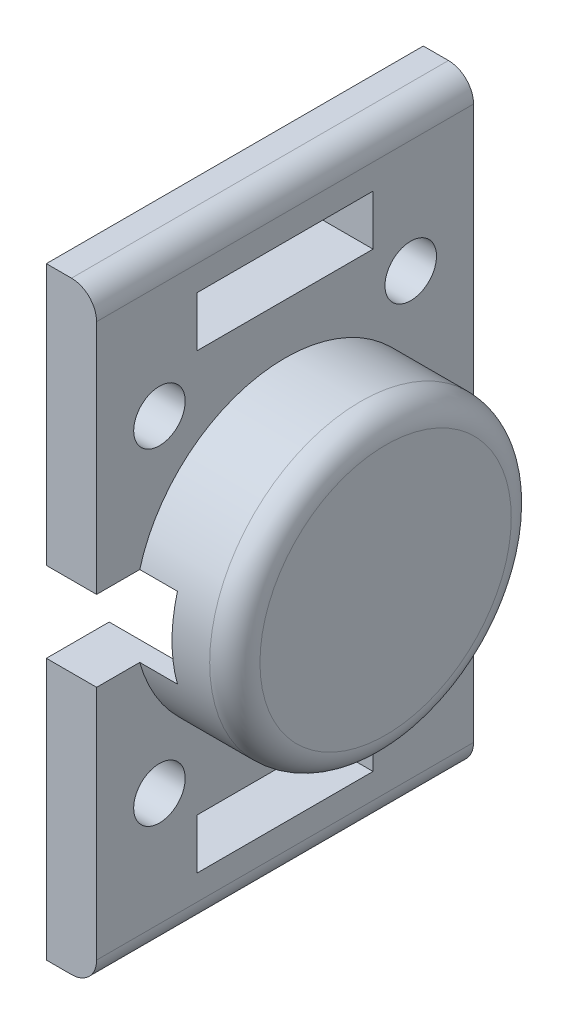
ISO-10303-21;
HEADER;
FILE_DESCRIPTION(('STEP AP214'),'2;1');
FILE_NAME('part.step','',(''),(''),'','','');
FILE_SCHEMA(('AUTOMOTIVE_DESIGN { 1 0 10303 214 1 1 1 1 }'));
ENDSEC;
DATA;
#1=APPLICATION_CONTEXT('core data for automotive mechanical design processes');
#2=APPLICATION_PROTOCOL_DEFINITION('international standard','automotive_design',2000,#1);
#3=PRODUCT_CONTEXT('',#1,'mechanical');
#4=PRODUCT('Part','Part','',(#3));
#5=PRODUCT_RELATED_PRODUCT_CATEGORY('part','',(#4));
#6=PRODUCT_DEFINITION_FORMATION('','',#4);
#7=PRODUCT_DEFINITION_CONTEXT('part definition',#1,'design');
#8=PRODUCT_DEFINITION('design','',#6,#7);
#9=PRODUCT_DEFINITION_SHAPE('','',#8);
#10=(LENGTH_UNIT() NAMED_UNIT(*) SI_UNIT(.MILLI.,.METRE.));
#11=(NAMED_UNIT(*) PLANE_ANGLE_UNIT() SI_UNIT($,.RADIAN.));
#12=(NAMED_UNIT(*) SI_UNIT($,.STERADIAN.) SOLID_ANGLE_UNIT());
#13=UNCERTAINTY_MEASURE_WITH_UNIT(LENGTH_MEASURE(1.E-05),#10,'distance_accuracy_value','');
#14=(GEOMETRIC_REPRESENTATION_CONTEXT(3) GLOBAL_UNCERTAINTY_ASSIGNED_CONTEXT((#13)) GLOBAL_UNIT_ASSIGNED_CONTEXT((#10,
#11,#12)) REPRESENTATION_CONTEXT('',''));
#15=CARTESIAN_POINT('',(0.,0.,0.));
#16=DIRECTION('',(0.,0.,1.));
#17=DIRECTION('',(1.,0.,0.));
#18=AXIS2_PLACEMENT_3D('',#15,#16,#17);
#19=CARTESIAN_POINT('',(-6.,-12.,0.));
#20=DIRECTION('',(0.,0.,-1.));
#21=DIRECTION('',(-1.,0.,0.));
#22=AXIS2_PLACEMENT_3D('',#19,#20,#21);
#23=PLANE('',#22);
#24=DIRECTION('',(0.,-1.,0.));
#25=VECTOR('',#24,1.);
#26=CARTESIAN_POINT('',(-4.,-12.,0.));
#27=LINE('',#26,#25);
#28=CARTESIAN_POINT('',(-4.,11.,0.));
#29=VERTEX_POINT('',#28);
#30=CARTESIAN_POINT('',(-4.,1.6,0.));
#31=VERTEX_POINT('',#30);
#32=EDGE_CURVE('E198',#29,#31,#27,.T.);
#33=ORIENTED_EDGE('',*,*,#32,.F.);
#34=CARTESIAN_POINT('',(-5.,11.,0.));
#35=DIRECTION('',(0.,0.,-1.));
#36=DIRECTION('',(-1.,0.,0.));
#37=AXIS2_PLACEMENT_3D('',#34,#35,#36);
#38=CIRCLE('',#37,1.);
#39=CARTESIAN_POINT('',(-5.,12.,0.));
#40=VERTEX_POINT('',#39);
#41=EDGE_CURVE('E66',#29,#40,#38,.F.);
#42=ORIENTED_EDGE('',*,*,#41,.T.);
#43=DIRECTION('',(1.,0.,0.));
#44=VECTOR('',#43,1.);
#45=CARTESIAN_POINT('',(-6.,12.,0.));
#46=LINE('',#45,#44);
#47=CARTESIAN_POINT('',(-6.,12.,0.));
#48=VERTEX_POINT('',#47);
#49=EDGE_CURVE('E354',#48,#40,#46,.T.);
#50=ORIENTED_EDGE('',*,*,#49,.F.);
#51=DIRECTION('',(0.,1.,0.));
#52=VECTOR('',#51,1.);
#53=CARTESIAN_POINT('',(-6.,-12.,0.));
#54=LINE('',#53,#52);
#55=CARTESIAN_POINT('',(-6.,1.6,0.));
#56=VERTEX_POINT('',#55);
#57=EDGE_CURVE('E327',#56,#48,#54,.T.);
#58=ORIENTED_EDGE('',*,*,#57,.F.);
#59=DIRECTION('',(-1.,0.,0.));
#60=VECTOR('',#59,1.);
#61=CARTESIAN_POINT('',(-6.,1.6,0.));
#62=LINE('',#61,#60);
#63=EDGE_CURVE('E303',#31,#56,#62,.T.);
#64=ORIENTED_EDGE('',*,*,#63,.F.);
#65=EDGE_LOOP('',(#33,#42,#50,#58,#64));
#66=FACE_BOUND('',#65,.T.);
#67=ADVANCED_FACE('F50',(#66),#23,.F.);
#68=DIRECTION('',(1.,0.,0.));
#69=VECTOR('',#68,1.);
#70=CARTESIAN_POINT('',(-6.,-12.,0.));
#71=LINE('',#70,#69);
#72=CARTESIAN_POINT('',(-6.,-12.,0.));
#73=VERTEX_POINT('',#72);
#74=CARTESIAN_POINT('',(-5.,-12.,0.));
#75=VERTEX_POINT('',#74);
#76=EDGE_CURVE('E344',#73,#75,#71,.T.);
#77=ORIENTED_EDGE('',*,*,#76,.T.);
#78=CARTESIAN_POINT('',(-5.,-11.,0.));
#79=DIRECTION('',(0.,0.,-1.));
#80=DIRECTION('',(-1.,0.,0.));
#81=AXIS2_PLACEMENT_3D('',#78,#79,#80);
#82=CIRCLE('',#81,1.);
#83=CARTESIAN_POINT('',(-4.,-11.,0.));
#84=VERTEX_POINT('',#83);
#85=EDGE_CURVE('E396',#75,#84,#82,.F.);
#86=ORIENTED_EDGE('',*,*,#85,.T.);
#87=CARTESIAN_POINT('',(-4.,-1.6,0.));
#88=VERTEX_POINT('',#87);
#89=EDGE_CURVE('E444',#88,#84,#27,.T.);
#90=ORIENTED_EDGE('',*,*,#89,.F.);
#91=DIRECTION('',(1.,0.,0.));
#92=VECTOR('',#91,1.);
#93=CARTESIAN_POINT('',(-6.,-1.6,0.));
#94=LINE('',#93,#92);
#95=CARTESIAN_POINT('',(-6.,-1.6,0.));
#96=VERTEX_POINT('',#95);
#97=EDGE_CURVE('E299',#96,#88,#94,.T.);
#98=ORIENTED_EDGE('',*,*,#97,.F.);
#99=EDGE_CURVE('E331',#73,#96,#54,.T.);
#100=ORIENTED_EDGE('',*,*,#99,.F.);
#101=EDGE_LOOP('',(#77,#86,#90,#98,#100));
#102=FACE_BOUND('',#101,.T.);
#103=ADVANCED_FACE('F419',(#102),#23,.F.);
#104=CARTESIAN_POINT('',(-6.,12.,-15.));
#105=DIRECTION('',(0.,-1.,0.));
#106=DIRECTION('',(0.,0.,-1.));
#107=AXIS2_PLACEMENT_3D('',#104,#105,#106);
#108=PLANE('',#107);
#109=ORIENTED_EDGE('',*,*,#49,.T.);
#110=DIRECTION('',(0.,0.,1.));
#111=VECTOR('',#110,1.);
#112=CARTESIAN_POINT('',(-5.,12.,-15.));
#113=LINE('',#112,#111);
#114=CARTESIAN_POINT('',(-5.,12.,-15.));
#115=VERTEX_POINT('',#114);
#116=EDGE_CURVE('E401',#40,#115,#113,.F.);
#117=ORIENTED_EDGE('',*,*,#116,.T.);
#118=DIRECTION('',(1.,0.,0.));
#119=VECTOR('',#118,1.);
#120=CARTESIAN_POINT('',(-6.,12.,-15.));
#121=LINE('',#120,#119);
#122=CARTESIAN_POINT('',(-6.,12.,-15.));
#123=VERTEX_POINT('',#122);
#124=EDGE_CURVE('E350',#123,#115,#121,.T.);
#125=ORIENTED_EDGE('',*,*,#124,.F.);
#126=DIRECTION('',(0.,0.,-1.));
#127=VECTOR('',#126,1.);
#128=CARTESIAN_POINT('',(-6.,12.,-15.));
#129=LINE('',#128,#127);
#130=EDGE_CURVE('E335',#48,#123,#129,.T.);
#131=ORIENTED_EDGE('',*,*,#130,.F.);
#132=EDGE_LOOP('',(#109,#117,#125,#131));
#133=FACE_BOUND('',#132,.T.);
#134=ADVANCED_FACE('F425',(#133),#108,.F.);
#135=CARTESIAN_POINT('',(-6.,-12.,-15.));
#136=DIRECTION('',(0.,0.,1.));
#137=DIRECTION('',(1.,0.,0.));
#138=AXIS2_PLACEMENT_3D('',#135,#136,#137);
#139=PLANE('',#138);
#140=DIRECTION('',(0.,1.,0.));
#141=VECTOR('',#140,1.);
#142=CARTESIAN_POINT('',(-4.,-12.,-15.));
#143=LINE('',#142,#141);
#144=CARTESIAN_POINT('',(-4.,-11.,-15.));
#145=VERTEX_POINT('',#144);
#146=CARTESIAN_POINT('',(-4.,11.,-15.));
#147=VERTEX_POINT('',#146);
#148=EDGE_CURVE('E450',#145,#147,#143,.T.);
#149=ORIENTED_EDGE('',*,*,#148,.F.);
#150=CARTESIAN_POINT('',(-5.,-11.,-15.));
#151=DIRECTION('',(0.,0.,1.));
#152=DIRECTION('',(1.,0.,0.));
#153=AXIS2_PLACEMENT_3D('',#150,#151,#152);
#154=CIRCLE('',#153,1.);
#155=CARTESIAN_POINT('',(-5.,-12.,-15.));
#156=VERTEX_POINT('',#155);
#157=EDGE_CURVE('E391',#145,#156,#154,.F.);
#158=ORIENTED_EDGE('',*,*,#157,.T.);
#159=DIRECTION('',(1.,0.,0.));
#160=VECTOR('',#159,1.);
#161=CARTESIAN_POINT('',(-6.,-12.,-15.));
#162=LINE('',#161,#160);
#163=CARTESIAN_POINT('',(-6.,-12.,-15.));
#164=VERTEX_POINT('',#163);
#165=EDGE_CURVE('E347',#164,#156,#162,.T.);
#166=ORIENTED_EDGE('',*,*,#165,.F.);
#167=DIRECTION('',(0.,-1.,0.));
#168=VECTOR('',#167,1.);
#169=CARTESIAN_POINT('',(-6.,-12.,-15.));
#170=LINE('',#169,#168);
#171=EDGE_CURVE('E338',#123,#164,#170,.T.);
#172=ORIENTED_EDGE('',*,*,#171,.F.);
#173=ORIENTED_EDGE('',*,*,#124,.T.);
#174=CARTESIAN_POINT('',(-5.,11.,-15.));
#175=DIRECTION('',(0.,0.,1.));
#176=DIRECTION('',(1.,0.,0.));
#177=AXIS2_PLACEMENT_3D('',#174,#175,#176);
#178=CIRCLE('',#177,1.);
#179=EDGE_CURVE('E388',#115,#147,#178,.F.);
#180=ORIENTED_EDGE('',*,*,#179,.T.);
#181=EDGE_LOOP('',(#149,#158,#166,#172,#173,#180));
#182=FACE_BOUND('',#181,.T.);
#183=ADVANCED_FACE('F522',(#182),#139,.F.);
#184=CARTESIAN_POINT('',(-6.,-12.,-15.));
#185=DIRECTION('',(0.,1.,0.));
#186=DIRECTION('',(0.,0.,1.));
#187=AXIS2_PLACEMENT_3D('',#184,#185,#186);
#188=PLANE('',#187);
#189=ORIENTED_EDGE('',*,*,#165,.T.);
#190=DIRECTION('',(0.,0.,-1.));
#191=VECTOR('',#190,1.);
#192=CARTESIAN_POINT('',(-5.,-12.,0.));
#193=LINE('',#192,#191);
#194=EDGE_CURVE('E74',#156,#75,#193,.F.);
#195=ORIENTED_EDGE('',*,*,#194,.T.);
#196=ORIENTED_EDGE('',*,*,#76,.F.);
#197=DIRECTION('',(0.,0.,1.));
#198=VECTOR('',#197,1.);
#199=CARTESIAN_POINT('',(-6.,-12.,-15.));
#200=LINE('',#199,#198);
#201=EDGE_CURVE('E341',#164,#73,#200,.T.);
#202=ORIENTED_EDGE('',*,*,#201,.F.);
#203=EDGE_LOOP('',(#189,#195,#196,#202));
#204=FACE_BOUND('',#203,.T.);
#205=ADVANCED_FACE('F520',(#204),#188,.F.);
#206=CARTESIAN_POINT('',(-2.5,0.,-7.5));
#207=DIRECTION('',(-1.,0.,0.));
#208=DIRECTION('',(0.,0.,1.));
#209=AXIS2_PLACEMENT_3D('',#206,#207,#208);
#210=PLANE('',#209);
#211=CARTESIAN_POINT('',(-2.5,0.,-7.5));
#212=DIRECTION('',(-1.,0.,0.));
#213=DIRECTION('',(0.,0.,1.));
#214=AXIS2_PLACEMENT_3D('',#211,#212,#213);
#215=CIRCLE('',#214,0.800000000000001);
#216=CARTESIAN_POINT('',(-2.5,0.,-6.7));
#217=VERTEX_POINT('',#216);
#218=EDGE_CURVE('E220',#217,#217,#215,.T.);
#219=ORIENTED_EDGE('',*,*,#218,.F.);
#220=EDGE_LOOP('',(#219));
#221=FACE_BOUND('',#220,.T.);
#222=DIRECTION('',(0.,0.,1.));
#223=VECTOR('',#222,1.);
#224=CARTESIAN_POINT('',(-2.5,-1.6,-15.001));
#225=LINE('',#224,#223);
#226=CARTESIAN_POINT('',(-2.5,-1.6,-2.49975000624969));
#227=VERTEX_POINT('',#226);
#228=CARTESIAN_POINT('',(-2.5,-1.6,-1.71726708207962));
#229=VERTEX_POINT('',#228);
#230=EDGE_CURVE('E314',#227,#229,#225,.T.);
#231=ORIENTED_EDGE('',*,*,#230,.T.);
#232=CARTESIAN_POINT('',(-2.5,0.,-7.5));
#233=DIRECTION('',(-1.,0.,0.));
#234=DIRECTION('',(0.,0.,1.));
#235=AXIS2_PLACEMENT_3D('',#232,#233,#234);
#236=CIRCLE('',#235,6.);
#237=CARTESIAN_POINT('',(-2.5,1.6,-1.71726708207961));
#238=VERTEX_POINT('',#237);
#239=EDGE_CURVE('E203',#229,#238,#236,.T.);
#240=ORIENTED_EDGE('',*,*,#239,.T.);
#241=DIRECTION('',(0.,0.,1.));
#242=VECTOR('',#241,1.);
#243=CARTESIAN_POINT('',(-2.5,1.6,-15.001));
#244=LINE('',#243,#242);
#245=CARTESIAN_POINT('',(-2.5,1.6,-2.49975000624969));
#246=VERTEX_POINT('',#245);
#247=EDGE_CURVE('E218',#246,#238,#244,.T.);
#248=ORIENTED_EDGE('',*,*,#247,.F.);
#249=CARTESIAN_POINT('',(-2.5,0.,-7.5));
#250=DIRECTION('',(-1.,0.,0.));
#251=DIRECTION('',(0.,0.,1.));
#252=AXIS2_PLACEMENT_3D('',#249,#250,#251);
#253=CIRCLE('',#252,5.25);
#254=EDGE_CURVE('E323',#246,#227,#253,.T.);
#255=ORIENTED_EDGE('',*,*,#254,.T.);
#256=EDGE_LOOP('',(#231,#240,#248,#255));
#257=FACE_BOUND('',#256,.T.);
#258=ADVANCED_FACE('F514',(#221,#257),#210,.T.);
#259=CARTESIAN_POINT('',(-6.,1.6,-15.001));
#260=DIRECTION('',(0.,1.,0.));
#261=DIRECTION('',(0.,0.,1.));
#262=AXIS2_PLACEMENT_3D('',#259,#260,#261);
#263=PLANE('',#262);
#264=DIRECTION('',(0.,0.,-1.));
#265=VECTOR('',#264,1.);
#266=CARTESIAN_POINT('',(-4.,1.6,-15.001));
#267=LINE('',#266,#265);
#268=CARTESIAN_POINT('',(-4.,1.6,-1.71726708207961));
#269=VERTEX_POINT('',#268);
#270=EDGE_CURVE('E191',#31,#269,#267,.T.);
#271=ORIENTED_EDGE('',*,*,#270,.F.);
#272=ORIENTED_EDGE('',*,*,#63,.T.);
#273=DIRECTION('',(0.,0.,1.));
#274=VECTOR('',#273,1.);
#275=CARTESIAN_POINT('',(-6.,1.6,-15.001));
#276=LINE('',#275,#274);
#277=CARTESIAN_POINT('',(-6.,1.6,-2.49975000624969));
#278=VERTEX_POINT('',#277);
#279=EDGE_CURVE('E307',#278,#56,#276,.T.);
#280=ORIENTED_EDGE('',*,*,#279,.F.);
#281=DIRECTION('',(-1.,0.,0.));
#282=VECTOR('',#281,1.);
#283=CARTESIAN_POINT('',(-2.5,1.6,-2.49975000624969));
#284=LINE('',#283,#282);
#285=EDGE_CURVE('E296',#278,#246,#284,.F.);
#286=ORIENTED_EDGE('',*,*,#285,.T.);
#287=ORIENTED_EDGE('',*,*,#247,.T.);
#288=DIRECTION('',(1.,0.,0.));
#289=VECTOR('',#288,1.);
#290=CARTESIAN_POINT('',(-4.,1.6,-1.71726708207961));
#291=LINE('',#290,#289);
#292=EDGE_CURVE('E207',#269,#238,#291,.T.);
#293=ORIENTED_EDGE('',*,*,#292,.F.);
#294=EDGE_LOOP('',(#271,#272,#280,#286,#287,#293));
#295=FACE_BOUND('',#294,.T.);
#296=ADVANCED_FACE('F216',(#295),#263,.F.);
#297=CARTESIAN_POINT('',(-6.,-1.6,-15.001));
#298=DIRECTION('',(0.,-1.,0.));
#299=DIRECTION('',(0.,0.,-1.));
#300=AXIS2_PLACEMENT_3D('',#297,#298,#299);
#301=PLANE('',#300);
#302=DIRECTION('',(0.,0.,1.));
#303=VECTOR('',#302,1.);
#304=CARTESIAN_POINT('',(-4.,-1.6,-15.001));
#305=LINE('',#304,#303);
#306=CARTESIAN_POINT('',(-4.,-1.6,-1.71726708207961));
#307=VERTEX_POINT('',#306);
#308=EDGE_CURVE('E448',#307,#88,#305,.T.);
#309=ORIENTED_EDGE('',*,*,#308,.F.);
#310=DIRECTION('',(1.,0.,0.));
#311=VECTOR('',#310,1.);
#312=CARTESIAN_POINT('',(-4.,-1.6,-1.71726708207961));
#313=LINE('',#312,#311);
#314=EDGE_CURVE('E210',#229,#307,#313,.F.);
#315=ORIENTED_EDGE('',*,*,#314,.F.);
#316=ORIENTED_EDGE('',*,*,#230,.F.);
#317=DIRECTION('',(-1.,0.,0.));
#318=VECTOR('',#317,1.);
#319=CARTESIAN_POINT('',(-2.5,-1.6,-2.49975000624969));
#320=LINE('',#319,#318);
#321=CARTESIAN_POINT('',(-6.,-1.6,-2.49975000624969));
#322=VERTEX_POINT('',#321);
#323=EDGE_CURVE('E311',#227,#322,#320,.T.);
#324=ORIENTED_EDGE('',*,*,#323,.T.);
#325=DIRECTION('',(0.,0.,1.));
#326=VECTOR('',#325,1.);
#327=CARTESIAN_POINT('',(-6.,-1.6,-15.001));
#328=LINE('',#327,#326);
#329=EDGE_CURVE('E306',#322,#96,#328,.T.);
#330=ORIENTED_EDGE('',*,*,#329,.T.);
#331=ORIENTED_EDGE('',*,*,#97,.T.);
#332=EDGE_LOOP('',(#309,#315,#316,#324,#330,#331));
#333=FACE_BOUND('',#332,.T.);
#334=ADVANCED_FACE('F516',(#333),#301,.F.);
#335=CARTESIAN_POINT('',(-10.,-8.,-4.));
#336=DIRECTION('',(0.,0.,1.));
#337=DIRECTION('',(1.,0.,0.));
#338=AXIS2_PLACEMENT_3D('',#335,#336,#337);
#339=PLANE('',#338);
#340=DIRECTION('',(0.,1.,0.));
#341=VECTOR('',#340,1.);
#342=CARTESIAN_POINT('',(-4.,-8.,-4.));
#343=LINE('',#342,#341);
#344=CARTESIAN_POINT('',(-4.,-10.,-4.));
#345=VERTEX_POINT('',#344);
#346=CARTESIAN_POINT('',(-4.,-8.,-4.));
#347=VERTEX_POINT('',#346);
#348=EDGE_CURVE('E455',#345,#347,#343,.T.);
#349=ORIENTED_EDGE('',*,*,#348,.F.);
#350=DIRECTION('',(1.,0.,0.));
#351=VECTOR('',#350,1.);
#352=CARTESIAN_POINT('',(-10.,-10.,-4.));
#353=LINE('',#352,#351);
#354=CARTESIAN_POINT('',(-6.,-10.,-4.));
#355=VERTEX_POINT('',#354);
#356=EDGE_CURVE('E250',#355,#345,#353,.T.);
#357=ORIENTED_EDGE('',*,*,#356,.F.);
#358=DIRECTION('',(0.,-1.,0.));
#359=VECTOR('',#358,1.);
#360=CARTESIAN_POINT('',(-6.,0.,-4.));
#361=LINE('',#360,#359);
#362=CARTESIAN_POINT('',(-6.,-8.,-4.));
#363=VERTEX_POINT('',#362);
#364=EDGE_CURVE('E276',#363,#355,#361,.T.);
#365=ORIENTED_EDGE('',*,*,#364,.F.);
#366=DIRECTION('',(1.,0.,0.));
#367=VECTOR('',#366,1.);
#368=CARTESIAN_POINT('',(-10.,-8.,-4.));
#369=LINE('',#368,#367);
#370=EDGE_CURVE('E231',#363,#347,#369,.T.);
#371=ORIENTED_EDGE('',*,*,#370,.T.);
#372=EDGE_LOOP('',(#349,#357,#365,#371));
#373=FACE_BOUND('',#372,.T.);
#374=ADVANCED_FACE('F540',(#373),#339,.F.);
#375=CARTESIAN_POINT('',(-10.,-8.,-4.));
#376=DIRECTION('',(0.,1.,0.));
#377=DIRECTION('',(0.,0.,1.));
#378=AXIS2_PLACEMENT_3D('',#375,#376,#377);
#379=PLANE('',#378);
#380=DIRECTION('',(0.,0.,-1.));
#381=VECTOR('',#380,1.);
#382=CARTESIAN_POINT('',(-4.,-8.,-4.));
#383=LINE('',#382,#381);
#384=CARTESIAN_POINT('',(-4.,-8.,-11.));
#385=VERTEX_POINT('',#384);
#386=EDGE_CURVE('E461',#347,#385,#383,.T.);
#387=ORIENTED_EDGE('',*,*,#386,.F.);
#388=ORIENTED_EDGE('',*,*,#370,.F.);
#389=DIRECTION('',(0.,0.,1.));
#390=VECTOR('',#389,1.);
#391=CARTESIAN_POINT('',(-6.,-8.,0.));
#392=LINE('',#391,#390);
#393=CARTESIAN_POINT('',(-6.,-8.,-11.));
#394=VERTEX_POINT('',#393);
#395=EDGE_CURVE('E272',#394,#363,#392,.T.);
#396=ORIENTED_EDGE('',*,*,#395,.F.);
#397=DIRECTION('',(1.,0.,0.));
#398=VECTOR('',#397,1.);
#399=CARTESIAN_POINT('',(-10.,-8.,-11.));
#400=LINE('',#399,#398);
#401=EDGE_CURVE('E258',#394,#385,#400,.T.);
#402=ORIENTED_EDGE('',*,*,#401,.T.);
#403=EDGE_LOOP('',(#387,#388,#396,#402));
#404=FACE_BOUND('',#403,.T.);
#405=ADVANCED_FACE('F543',(#404),#379,.F.);
#406=CARTESIAN_POINT('',(-10.,-8.,-11.));
#407=DIRECTION('',(0.,0.,-1.));
#408=DIRECTION('',(-1.,0.,0.));
#409=AXIS2_PLACEMENT_3D('',#406,#407,#408);
#410=PLANE('',#409);
#411=DIRECTION('',(0.,-1.,0.));
#412=VECTOR('',#411,1.);
#413=CARTESIAN_POINT('',(-4.,-8.,-11.));
#414=LINE('',#413,#412);
#415=CARTESIAN_POINT('',(-4.,-10.,-11.));
#416=VERTEX_POINT('',#415);
#417=EDGE_CURVE('E464',#385,#416,#414,.T.);
#418=ORIENTED_EDGE('',*,*,#417,.F.);
#419=ORIENTED_EDGE('',*,*,#401,.F.);
#420=DIRECTION('',(0.,1.,0.));
#421=VECTOR('',#420,1.);
#422=CARTESIAN_POINT('',(-6.,0.,-11.));
#423=LINE('',#422,#421);
#424=CARTESIAN_POINT('',(-6.,-10.,-11.));
#425=VERTEX_POINT('',#424);
#426=EDGE_CURVE('E268',#425,#394,#423,.T.);
#427=ORIENTED_EDGE('',*,*,#426,.F.);
#428=DIRECTION('',(1.,0.,0.));
#429=VECTOR('',#428,1.);
#430=CARTESIAN_POINT('',(-10.,-10.,-11.));
#431=LINE('',#430,#429);
#432=EDGE_CURVE('E254',#425,#416,#431,.T.);
#433=ORIENTED_EDGE('',*,*,#432,.T.);
#434=EDGE_LOOP('',(#418,#419,#427,#433));
#435=FACE_BOUND('',#434,.T.);
#436=ADVANCED_FACE('F546',(#435),#410,.F.);
#437=CARTESIAN_POINT('',(-10.,-10.,-4.));
#438=DIRECTION('',(0.,-1.,0.));
#439=DIRECTION('',(0.,0.,-1.));
#440=AXIS2_PLACEMENT_3D('',#437,#438,#439);
#441=PLANE('',#440);
#442=DIRECTION('',(0.,0.,1.));
#443=VECTOR('',#442,1.);
#444=CARTESIAN_POINT('',(-4.,-10.,-4.));
#445=LINE('',#444,#443);
#446=EDGE_CURVE('E467',#416,#345,#445,.T.);
#447=ORIENTED_EDGE('',*,*,#446,.F.);
#448=ORIENTED_EDGE('',*,*,#432,.F.);
#449=DIRECTION('',(0.,0.,-1.));
#450=VECTOR('',#449,1.);
#451=CARTESIAN_POINT('',(-6.,-10.,0.));
#452=LINE('',#451,#450);
#453=EDGE_CURVE('E237',#355,#425,#452,.T.);
#454=ORIENTED_EDGE('',*,*,#453,.F.);
#455=ORIENTED_EDGE('',*,*,#356,.T.);
#456=EDGE_LOOP('',(#447,#448,#454,#455));
#457=FACE_BOUND('',#456,.T.);
#458=ADVANCED_FACE('F550',(#457),#441,.F.);
#459=CARTESIAN_POINT('',(-10.,8.,-4.));
#460=DIRECTION('',(0.,0.,1.));
#461=DIRECTION('',(1.,0.,0.));
#462=AXIS2_PLACEMENT_3D('',#459,#460,#461);
#463=PLANE('',#462);
#464=DIRECTION('',(0.,1.,0.));
#465=VECTOR('',#464,1.);
#466=CARTESIAN_POINT('',(-4.,8.,-4.));
#467=LINE('',#466,#465);
#468=CARTESIAN_POINT('',(-4.,8.,-4.));
#469=VERTEX_POINT('',#468);
#470=CARTESIAN_POINT('',(-4.,10.,-4.));
#471=VERTEX_POINT('',#470);
#472=EDGE_CURVE('E470',#469,#471,#467,.T.);
#473=ORIENTED_EDGE('',*,*,#472,.F.);
#474=DIRECTION('',(1.,0.,0.));
#475=VECTOR('',#474,1.);
#476=CARTESIAN_POINT('',(-10.,8.,-4.));
#477=LINE('',#476,#475);
#478=CARTESIAN_POINT('',(-6.,8.,-4.));
#479=VERTEX_POINT('',#478);
#480=EDGE_CURVE('E246',#479,#469,#477,.T.);
#481=ORIENTED_EDGE('',*,*,#480,.F.);
#482=DIRECTION('',(0.,-1.,0.));
#483=VECTOR('',#482,1.);
#484=CARTESIAN_POINT('',(-6.,0.,-4.));
#485=LINE('',#484,#483);
#486=CARTESIAN_POINT('',(-6.,10.,-4.));
#487=VERTEX_POINT('',#486);
#488=EDGE_CURVE('E292',#487,#479,#485,.T.);
#489=ORIENTED_EDGE('',*,*,#488,.F.);
#490=DIRECTION('',(1.,0.,0.));
#491=VECTOR('',#490,1.);
#492=CARTESIAN_POINT('',(-10.,10.,-4.));
#493=LINE('',#492,#491);
#494=EDGE_CURVE('E233',#487,#471,#493,.T.);
#495=ORIENTED_EDGE('',*,*,#494,.T.);
#496=EDGE_LOOP('',(#473,#481,#489,#495));
#497=FACE_BOUND('',#496,.T.);
#498=ADVANCED_FACE('F554',(#497),#463,.F.);
#499=CARTESIAN_POINT('',(-10.,10.,-4.));
#500=DIRECTION('',(0.,1.,0.));
#501=DIRECTION('',(0.,0.,1.));
#502=AXIS2_PLACEMENT_3D('',#499,#500,#501);
#503=PLANE('',#502);
#504=DIRECTION('',(0.,0.,-1.));
#505=VECTOR('',#504,1.);
#506=CARTESIAN_POINT('',(-4.,10.,-4.));
#507=LINE('',#506,#505);
#508=CARTESIAN_POINT('',(-4.,10.,-11.));
#509=VERTEX_POINT('',#508);
#510=EDGE_CURVE('E473',#471,#509,#507,.T.);
#511=ORIENTED_EDGE('',*,*,#510,.F.);
#512=ORIENTED_EDGE('',*,*,#494,.F.);
#513=DIRECTION('',(0.,0.,1.));
#514=VECTOR('',#513,1.);
#515=CARTESIAN_POINT('',(-6.,10.,0.));
#516=LINE('',#515,#514);
#517=CARTESIAN_POINT('',(-6.,10.,-11.));
#518=VERTEX_POINT('',#517);
#519=EDGE_CURVE('E288',#518,#487,#516,.T.);
#520=ORIENTED_EDGE('',*,*,#519,.F.);
#521=DIRECTION('',(1.,0.,0.));
#522=VECTOR('',#521,1.);
#523=CARTESIAN_POINT('',(-10.,10.,-11.));
#524=LINE('',#523,#522);
#525=EDGE_CURVE('E238',#518,#509,#524,.T.);
#526=ORIENTED_EDGE('',*,*,#525,.T.);
#527=EDGE_LOOP('',(#511,#512,#520,#526));
#528=FACE_BOUND('',#527,.T.);
#529=ADVANCED_FACE('F561',(#528),#503,.F.);
#530=CARTESIAN_POINT('',(-10.,8.,-11.));
#531=DIRECTION('',(0.,0.,-1.));
#532=DIRECTION('',(-1.,0.,0.));
#533=AXIS2_PLACEMENT_3D('',#530,#531,#532);
#534=PLANE('',#533);
#535=DIRECTION('',(0.,-1.,0.));
#536=VECTOR('',#535,1.);
#537=CARTESIAN_POINT('',(-4.,8.,-11.));
#538=LINE('',#537,#536);
#539=CARTESIAN_POINT('',(-4.,8.,-11.));
#540=VERTEX_POINT('',#539);
#541=EDGE_CURVE('E212',#509,#540,#538,.T.);
#542=ORIENTED_EDGE('',*,*,#541,.F.);
#543=ORIENTED_EDGE('',*,*,#525,.F.);
#544=DIRECTION('',(0.,1.,0.));
#545=VECTOR('',#544,1.);
#546=CARTESIAN_POINT('',(-6.,0.,-11.));
#547=LINE('',#546,#545);
#548=CARTESIAN_POINT('',(-6.,8.,-11.));
#549=VERTEX_POINT('',#548);
#550=EDGE_CURVE('E284',#549,#518,#547,.T.);
#551=ORIENTED_EDGE('',*,*,#550,.F.);
#552=DIRECTION('',(1.,0.,0.));
#553=VECTOR('',#552,1.);
#554=CARTESIAN_POINT('',(-10.,8.,-11.));
#555=LINE('',#554,#553);
#556=EDGE_CURVE('E242',#549,#540,#555,.T.);
#557=ORIENTED_EDGE('',*,*,#556,.T.);
#558=EDGE_LOOP('',(#542,#543,#551,#557));
#559=FACE_BOUND('',#558,.T.);
#560=ADVANCED_FACE('F565',(#559),#534,.F.);
#561=CARTESIAN_POINT('',(-10.,8.,-4.));
#562=DIRECTION('',(0.,-1.,0.));
#563=DIRECTION('',(0.,0.,-1.));
#564=AXIS2_PLACEMENT_3D('',#561,#562,#563);
#565=PLANE('',#564);
#566=DIRECTION('',(0.,0.,1.));
#567=VECTOR('',#566,1.);
#568=CARTESIAN_POINT('',(-4.,8.,-4.));
#569=LINE('',#568,#567);
#570=EDGE_CURVE('E357',#540,#469,#569,.T.);
#571=ORIENTED_EDGE('',*,*,#570,.F.);
#572=ORIENTED_EDGE('',*,*,#556,.F.);
#573=DIRECTION('',(0.,0.,-1.));
#574=VECTOR('',#573,1.);
#575=CARTESIAN_POINT('',(-6.,8.,0.));
#576=LINE('',#575,#574);
#577=EDGE_CURVE('E280',#479,#549,#576,.T.);
#578=ORIENTED_EDGE('',*,*,#577,.F.);
#579=ORIENTED_EDGE('',*,*,#480,.T.);
#580=EDGE_LOOP('',(#571,#572,#578,#579));
#581=FACE_BOUND('',#580,.T.);
#582=ADVANCED_FACE('F496',(#581),#565,.F.);
#583=CARTESIAN_POINT('',(-6.,0.,0.));
#584=DIRECTION('',(1.,0.,0.));
#585=DIRECTION('',(0.,0.,-1.));
#586=AXIS2_PLACEMENT_3D('',#583,#584,#585);
#587=PLANE('',#586);
#588=CARTESIAN_POINT('',(-6.,6.5,-12.5));
#589=DIRECTION('',(-1.,0.,0.));
#590=DIRECTION('',(0.,0.,1.));
#591=AXIS2_PLACEMENT_3D('',#588,#589,#590);
#592=CIRCLE('',#591,1.025);
#593=CARTESIAN_POINT('',(-6.,6.5,-11.475));
#594=VERTEX_POINT('',#593);
#595=EDGE_CURVE('E381',#594,#594,#592,.T.);
#596=ORIENTED_EDGE('',*,*,#595,.F.);
#597=EDGE_LOOP('',(#596));
#598=FACE_BOUND('',#597,.T.);
#599=CARTESIAN_POINT('',(-6.,6.5,-2.5));
#600=DIRECTION('',(-1.,0.,0.));
#601=DIRECTION('',(0.,0.,1.));
#602=AXIS2_PLACEMENT_3D('',#599,#600,#601);
#603=CIRCLE('',#602,1.025);
#604=CARTESIAN_POINT('',(-6.,6.5,-1.475));
#605=VERTEX_POINT('',#604);
#606=EDGE_CURVE('E376',#605,#605,#603,.T.);
#607=ORIENTED_EDGE('',*,*,#606,.F.);
#608=EDGE_LOOP('',(#607));
#609=FACE_BOUND('',#608,.T.);
#610=CARTESIAN_POINT('',(-6.,-6.5,-2.5));
#611=DIRECTION('',(-1.,0.,0.));
#612=DIRECTION('',(0.,0.,1.));
#613=AXIS2_PLACEMENT_3D('',#610,#611,#612);
#614=CIRCLE('',#613,1.025);
#615=CARTESIAN_POINT('',(-6.,-6.5,-1.475));
#616=VERTEX_POINT('',#615);
#617=EDGE_CURVE('E371',#616,#616,#614,.T.);
#618=ORIENTED_EDGE('',*,*,#617,.F.);
#619=EDGE_LOOP('',(#618));
#620=FACE_BOUND('',#619,.T.);
#621=CARTESIAN_POINT('',(-6.,-6.5,-12.5));
#622=DIRECTION('',(-1.,0.,0.));
#623=DIRECTION('',(0.,0.,1.));
#624=AXIS2_PLACEMENT_3D('',#621,#622,#623);
#625=CIRCLE('',#624,1.025);
#626=CARTESIAN_POINT('',(-6.,-6.5,-11.475));
#627=VERTEX_POINT('',#626);
#628=EDGE_CURVE('E366',#627,#627,#625,.T.);
#629=ORIENTED_EDGE('',*,*,#628,.F.);
#630=EDGE_LOOP('',(#629));
#631=FACE_BOUND('',#630,.T.);
#632=ORIENTED_EDGE('',*,*,#519,.T.);
#633=ORIENTED_EDGE('',*,*,#488,.T.);
#634=ORIENTED_EDGE('',*,*,#577,.T.);
#635=ORIENTED_EDGE('',*,*,#550,.T.);
#636=EDGE_LOOP('',(#632,#633,#634,#635));
#637=FACE_BOUND('',#636,.T.);
#638=ORIENTED_EDGE('',*,*,#395,.T.);
#639=ORIENTED_EDGE('',*,*,#364,.T.);
#640=ORIENTED_EDGE('',*,*,#453,.T.);
#641=ORIENTED_EDGE('',*,*,#426,.T.);
#642=EDGE_LOOP('',(#638,#639,#640,#641));
#643=FACE_BOUND('',#642,.T.);
#644=CARTESIAN_POINT('',(-6.,0.,-7.5));
#645=DIRECTION('',(-1.,0.,0.));
#646=DIRECTION('',(0.,0.,1.));
#647=AXIS2_PLACEMENT_3D('',#644,#645,#646);
#648=CIRCLE('',#647,5.25);
#649=EDGE_CURVE('E322',#278,#322,#648,.T.);
#650=ORIENTED_EDGE('',*,*,#649,.F.);
#651=ORIENTED_EDGE('',*,*,#279,.T.);
#652=ORIENTED_EDGE('',*,*,#57,.T.);
#653=ORIENTED_EDGE('',*,*,#130,.T.);
#654=ORIENTED_EDGE('',*,*,#171,.T.);
#655=ORIENTED_EDGE('',*,*,#201,.T.);
#656=ORIENTED_EDGE('',*,*,#99,.T.);
#657=ORIENTED_EDGE('',*,*,#329,.F.);
#658=EDGE_LOOP('',(#650,#651,#652,#653,#654,#655,#656,#657));
#659=FACE_BOUND('',#658,.T.);
#660=ADVANCED_FACE('F492',(#598,#609,#620,#631,#637,#643,#659),#587,.F.);
#661=CARTESIAN_POINT('',(-2.5,0.,-7.5));
#662=DIRECTION('',(-1.,0.,0.));
#663=DIRECTION('',(0.,0.,1.));
#664=AXIS2_PLACEMENT_3D('',#661,#662,#663);
#665=CYLINDRICAL_SURFACE('',#664,5.25);
#666=ORIENTED_EDGE('',*,*,#254,.F.);
#667=ORIENTED_EDGE('',*,*,#285,.F.);
#668=ORIENTED_EDGE('',*,*,#649,.T.);
#669=ORIENTED_EDGE('',*,*,#323,.F.);
#670=EDGE_LOOP('',(#666,#667,#668,#669));
#671=FACE_BOUND('',#670,.T.);
#672=ADVANCED_FACE('F495',(#671),#665,.F.);
#673=CARTESIAN_POINT('',(-1.3,0.,-7.5));
#674=DIRECTION('',(-1.,0.,0.));
#675=DIRECTION('',(0.,0.,1.));
#676=AXIS2_PLACEMENT_3D('',#673,#674,#675);
#677=CYLINDRICAL_SURFACE('',#676,0.800000000000001);
#678=CARTESIAN_POINT('',(-1.3,0.,-7.5));
#679=DIRECTION('',(-1.,0.,0.));
#680=DIRECTION('',(0.,0.,1.));
#681=AXIS2_PLACEMENT_3D('',#678,#679,#680);
#682=CIRCLE('',#681,0.800000000000001);
#683=CARTESIAN_POINT('',(-1.3,0.,-6.7));
#684=VERTEX_POINT('',#683);
#685=EDGE_CURVE('E225',#684,#684,#682,.T.);
#686=ORIENTED_EDGE('',*,*,#685,.F.);
#687=EDGE_LOOP('',(#686));
#688=FACE_BOUND('',#687,.T.);
#689=ORIENTED_EDGE('',*,*,#218,.T.);
#690=EDGE_LOOP('',(#689));
#691=FACE_BOUND('',#690,.T.);
#692=ADVANCED_FACE('F536',(#688,#691),#677,.F.);
#693=CARTESIAN_POINT('',(-1.3,0.,-7.5));
#694=DIRECTION('',(-1.,0.,0.));
#695=DIRECTION('',(0.,0.,1.));
#696=AXIS2_PLACEMENT_3D('',#693,#694,#695);
#697=PLANE('',#696);
#698=ORIENTED_EDGE('',*,*,#685,.T.);
#699=EDGE_LOOP('',(#698));
#700=FACE_BOUND('',#699,.T.);
#701=ADVANCED_FACE('F575',(#700),#697,.T.);
#702=CARTESIAN_POINT('',(-4.,0.,-7.5));
#703=DIRECTION('',(1.,0.,0.));
#704=DIRECTION('',(0.,0.,-1.));
#705=AXIS2_PLACEMENT_3D('',#702,#703,#704);
#706=CYLINDRICAL_SURFACE('',#705,6.);
#707=CARTESIAN_POINT('',(-1.,0.,-7.5));
#708=DIRECTION('',(1.,0.,0.));
#709=DIRECTION('',(0.,0.,-1.));
#710=AXIS2_PLACEMENT_3D('',#707,#708,#709);
#711=CIRCLE('',#710,6.);
#712=CARTESIAN_POINT('',(-1.,0.,-13.5));
#713=VERTEX_POINT('',#712);
#714=EDGE_CURVE('E12',#713,#713,#711,.F.);
#715=ORIENTED_EDGE('',*,*,#714,.T.);
#716=EDGE_LOOP('',(#715));
#717=FACE_BOUND('',#716,.T.);
#718=ORIENTED_EDGE('',*,*,#292,.T.);
#719=ORIENTED_EDGE('',*,*,#239,.F.);
#720=ORIENTED_EDGE('',*,*,#314,.T.);
#721=CARTESIAN_POINT('',(-4.,0.,-7.5));
#722=DIRECTION('',(1.,0.,0.));
#723=DIRECTION('',(0.,0.,-1.));
#724=AXIS2_PLACEMENT_3D('',#721,#722,#723);
#725=CIRCLE('',#724,6.);
#726=EDGE_CURVE('E195',#307,#269,#725,.T.);
#727=ORIENTED_EDGE('',*,*,#726,.T.);
#728=EDGE_LOOP('',(#718,#719,#720,#727));
#729=FACE_BOUND('',#728,.T.);
#730=ADVANCED_FACE('F206',(#717,#729),#706,.T.);
#731=CARTESIAN_POINT('',(-4.,0.,-7.5));
#732=DIRECTION('',(1.,0.,0.));
#733=DIRECTION('',(0.,0.,-1.));
#734=AXIS2_PLACEMENT_3D('',#731,#732,#733);
#735=PLANE('',#734);
#736=CARTESIAN_POINT('',(-4.,6.5,-12.5));
#737=DIRECTION('',(1.,0.,0.));
#738=DIRECTION('',(0.,0.,-1.));
#739=AXIS2_PLACEMENT_3D('',#736,#737,#738);
#740=CIRCLE('',#739,1.025);
#741=CARTESIAN_POINT('',(-4.,6.5,-13.525));
#742=VERTEX_POINT('',#741);
#743=EDGE_CURVE('E377',#742,#742,#740,.T.);
#744=ORIENTED_EDGE('',*,*,#743,.F.);
#745=EDGE_LOOP('',(#744));
#746=FACE_BOUND('',#745,.T.);
#747=CARTESIAN_POINT('',(-4.,6.5,-2.5));
#748=DIRECTION('',(1.,0.,0.));
#749=DIRECTION('',(0.,0.,-1.));
#750=AXIS2_PLACEMENT_3D('',#747,#748,#749);
#751=CIRCLE('',#750,1.025);
#752=CARTESIAN_POINT('',(-4.,6.5,-3.525));
#753=VERTEX_POINT('',#752);
#754=EDGE_CURVE('E372',#753,#753,#751,.T.);
#755=ORIENTED_EDGE('',*,*,#754,.F.);
#756=EDGE_LOOP('',(#755));
#757=FACE_BOUND('',#756,.T.);
#758=CARTESIAN_POINT('',(-4.,-6.5,-2.5));
#759=DIRECTION('',(1.,0.,0.));
#760=DIRECTION('',(0.,0.,-1.));
#761=AXIS2_PLACEMENT_3D('',#758,#759,#760);
#762=CIRCLE('',#761,1.025);
#763=CARTESIAN_POINT('',(-4.,-6.5,-3.525));
#764=VERTEX_POINT('',#763);
#765=EDGE_CURVE('E367',#764,#764,#762,.T.);
#766=ORIENTED_EDGE('',*,*,#765,.F.);
#767=EDGE_LOOP('',(#766));
#768=FACE_BOUND('',#767,.T.);
#769=CARTESIAN_POINT('',(-4.,-6.5,-12.5));
#770=DIRECTION('',(1.,0.,0.));
#771=DIRECTION('',(0.,0.,-1.));
#772=AXIS2_PLACEMENT_3D('',#769,#770,#771);
#773=CIRCLE('',#772,1.025);
#774=CARTESIAN_POINT('',(-4.,-6.5,-13.525));
#775=VERTEX_POINT('',#774);
#776=EDGE_CURVE('E213',#775,#775,#773,.T.);
#777=ORIENTED_EDGE('',*,*,#776,.F.);
#778=EDGE_LOOP('',(#777));
#779=FACE_BOUND('',#778,.T.);
#780=ORIENTED_EDGE('',*,*,#348,.T.);
#781=ORIENTED_EDGE('',*,*,#386,.T.);
#782=ORIENTED_EDGE('',*,*,#417,.T.);
#783=ORIENTED_EDGE('',*,*,#446,.T.);
#784=EDGE_LOOP('',(#780,#781,#782,#783));
#785=FACE_BOUND('',#784,.T.);
#786=ORIENTED_EDGE('',*,*,#472,.T.);
#787=ORIENTED_EDGE('',*,*,#510,.T.);
#788=ORIENTED_EDGE('',*,*,#541,.T.);
#789=ORIENTED_EDGE('',*,*,#570,.T.);
#790=EDGE_LOOP('',(#786,#787,#788,#789));
#791=FACE_BOUND('',#790,.T.);
#792=ORIENTED_EDGE('',*,*,#89,.T.);
#793=DIRECTION('',(0.,0.,-1.));
#794=VECTOR('',#793,1.);
#795=CARTESIAN_POINT('',(-4.,-11.,-15.));
#796=LINE('',#795,#794);
#797=EDGE_CURVE('E384',#84,#145,#796,.T.);
#798=ORIENTED_EDGE('',*,*,#797,.T.);
#799=ORIENTED_EDGE('',*,*,#148,.T.);
#800=DIRECTION('',(0.,0.,1.));
#801=VECTOR('',#800,1.);
#802=CARTESIAN_POINT('',(-4.,11.,0.));
#803=LINE('',#802,#801);
#804=EDGE_CURVE('E362',#147,#29,#803,.T.);
#805=ORIENTED_EDGE('',*,*,#804,.T.);
#806=ORIENTED_EDGE('',*,*,#32,.T.);
#807=ORIENTED_EDGE('',*,*,#270,.T.);
#808=ORIENTED_EDGE('',*,*,#726,.F.);
#809=ORIENTED_EDGE('',*,*,#308,.T.);
#810=EDGE_LOOP('',(#792,#798,#799,#805,#806,#807,#808,#809));
#811=FACE_BOUND('',#810,.T.);
#812=ADVANCED_FACE('F194',(#746,#757,#768,#779,#785,#791,#811),#735,.T.);
#813=CARTESIAN_POINT('',(0.,0.,0.));
#814=DIRECTION('',(1.,0.,0.));
#815=DIRECTION('',(0.,0.,-1.));
#816=AXIS2_PLACEMENT_3D('',#813,#814,#815);
#817=PLANE('',#816);
#818=CARTESIAN_POINT('',(0.,0.,-7.5));
#819=DIRECTION('',(1.,0.,0.));
#820=DIRECTION('',(0.,0.,-1.));
#821=AXIS2_PLACEMENT_3D('',#818,#819,#820);
#822=CIRCLE('',#821,5.);
#823=CARTESIAN_POINT('',(0.,0.,-12.5));
#824=VERTEX_POINT('',#823);
#825=EDGE_CURVE('E59',#824,#824,#822,.T.);
#826=ORIENTED_EDGE('',*,*,#825,.T.);
#827=EDGE_LOOP('',(#826));
#828=FACE_BOUND('',#827,.T.);
#829=ADVANCED_FACE('F407',(#828),#817,.T.);
#830=CARTESIAN_POINT('',(-6.,-6.5,-12.5));
#831=DIRECTION('',(-1.,0.,0.));
#832=DIRECTION('',(0.,0.,1.));
#833=AXIS2_PLACEMENT_3D('',#830,#831,#832);
#834=CYLINDRICAL_SURFACE('',#833,1.025);
#835=ORIENTED_EDGE('',*,*,#776,.T.);
#836=EDGE_LOOP('',(#835));
#837=FACE_BOUND('',#836,.T.);
#838=ORIENTED_EDGE('',*,*,#628,.T.);
#839=EDGE_LOOP('',(#838));
#840=FACE_BOUND('',#839,.T.);
#841=ADVANCED_FACE('F533',(#837,#840),#834,.F.);
#842=CARTESIAN_POINT('',(-6.,-6.5,-2.5));
#843=DIRECTION('',(-1.,0.,0.));
#844=DIRECTION('',(0.,0.,1.));
#845=AXIS2_PLACEMENT_3D('',#842,#843,#844);
#846=CYLINDRICAL_SURFACE('',#845,1.025);
#847=ORIENTED_EDGE('',*,*,#765,.T.);
#848=EDGE_LOOP('',(#847));
#849=FACE_BOUND('',#848,.T.);
#850=ORIENTED_EDGE('',*,*,#617,.T.);
#851=EDGE_LOOP('',(#850));
#852=FACE_BOUND('',#851,.T.);
#853=ADVANCED_FACE('F587',(#849,#852),#846,.F.);
#854=CARTESIAN_POINT('',(-6.,6.5,-2.5));
#855=DIRECTION('',(-1.,0.,0.));
#856=DIRECTION('',(0.,0.,1.));
#857=AXIS2_PLACEMENT_3D('',#854,#855,#856);
#858=CYLINDRICAL_SURFACE('',#857,1.025);
#859=ORIENTED_EDGE('',*,*,#754,.T.);
#860=EDGE_LOOP('',(#859));
#861=FACE_BOUND('',#860,.T.);
#862=ORIENTED_EDGE('',*,*,#606,.T.);
#863=EDGE_LOOP('',(#862));
#864=FACE_BOUND('',#863,.T.);
#865=ADVANCED_FACE('F437',(#861,#864),#858,.F.);
#866=CARTESIAN_POINT('',(-6.,6.5,-12.5));
#867=DIRECTION('',(-1.,0.,0.));
#868=DIRECTION('',(0.,0.,1.));
#869=AXIS2_PLACEMENT_3D('',#866,#867,#868);
#870=CYLINDRICAL_SURFACE('',#869,1.025);
#871=ORIENTED_EDGE('',*,*,#743,.T.);
#872=EDGE_LOOP('',(#871));
#873=FACE_BOUND('',#872,.T.);
#874=ORIENTED_EDGE('',*,*,#595,.T.);
#875=EDGE_LOOP('',(#874));
#876=FACE_BOUND('',#875,.T.);
#877=ADVANCED_FACE('F431',(#873,#876),#870,.F.);
#878=CARTESIAN_POINT('',(-5.,-11.,-7.5));
#879=DIRECTION('',(0.,0.,1.));
#880=DIRECTION('',(1.,0.,0.));
#881=AXIS2_PLACEMENT_3D('',#878,#879,#880);
#882=CYLINDRICAL_SURFACE('',#881,1.);
#883=ORIENTED_EDGE('',*,*,#85,.F.);
#884=ORIENTED_EDGE('',*,*,#194,.F.);
#885=ORIENTED_EDGE('',*,*,#157,.F.);
#886=ORIENTED_EDGE('',*,*,#797,.F.);
#887=EDGE_LOOP('',(#883,#884,#885,#886));
#888=FACE_BOUND('',#887,.T.);
#889=ADVANCED_FACE('F415',(#888),#882,.T.);
#890=CARTESIAN_POINT('',(-5.,11.,-7.5));
#891=DIRECTION('',(0.,0.,-1.));
#892=DIRECTION('',(-1.,0.,0.));
#893=AXIS2_PLACEMENT_3D('',#890,#891,#892);
#894=CYLINDRICAL_SURFACE('',#893,1.);
#895=ORIENTED_EDGE('',*,*,#179,.F.);
#896=ORIENTED_EDGE('',*,*,#116,.F.);
#897=ORIENTED_EDGE('',*,*,#41,.F.);
#898=ORIENTED_EDGE('',*,*,#804,.F.);
#899=EDGE_LOOP('',(#895,#896,#897,#898));
#900=FACE_BOUND('',#899,.T.);
#901=ADVANCED_FACE('F410',(#900),#894,.T.);
#902=CARTESIAN_POINT('',(-1.,0.,-7.5));
#903=DIRECTION('',(1.,0.,0.));
#904=DIRECTION('',(0.,0.,-1.));
#905=AXIS2_PLACEMENT_3D('',#902,#903,#904);
#906=TOROIDAL_SURFACE('',#905,5.,1.);
#907=ORIENTED_EDGE('',*,*,#714,.F.);
#908=EDGE_LOOP('',(#907));
#909=FACE_BOUND('',#908,.T.);
#910=ORIENTED_EDGE('',*,*,#825,.F.);
#911=EDGE_LOOP('',(#910));
#912=FACE_BOUND('',#911,.T.);
#913=ADVANCED_FACE('F52',(#909,#912),#906,.T.);
#914=CLOSED_SHELL('',(#67,#103,#134,#183,#205,#258,#296,#334,#374,#405,#436,#458,#498,#529,#560,
#582,#660,#672,#692,#701,#730,#812,#829,#841,#853,#865,#877,#889,#901,#913));
#915=MANIFOLD_SOLID_BREP('B2',#914);
#916=ADVANCED_BREP_SHAPE_REPRESENTATION('',(#18,#915),#14);
#917=SHAPE_DEFINITION_REPRESENTATION(#9,#916);
ENDSEC;
END-ISO-10303-21;
